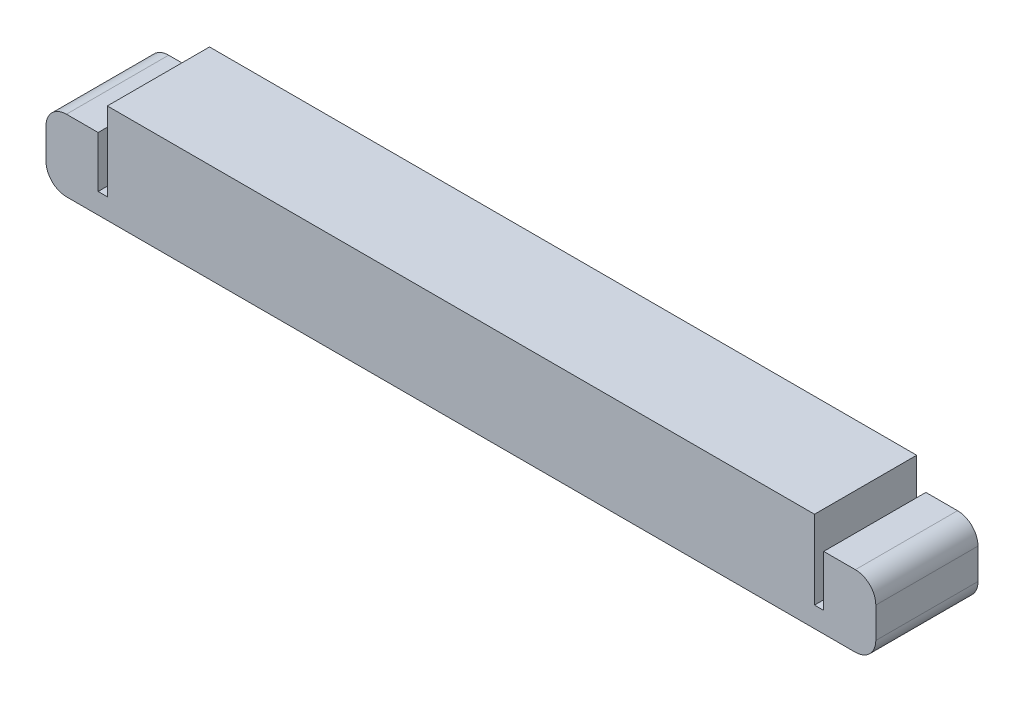
ISO-10303-21;
HEADER;
FILE_DESCRIPTION(('STEP AP214'),'2;1');
FILE_NAME('part.step','',(''),(''),'','','');
FILE_SCHEMA(('AUTOMOTIVE_DESIGN { 1 0 10303 214 1 1 1 1 }'));
ENDSEC;
DATA;
#1=APPLICATION_CONTEXT('core data for automotive mechanical design processes');
#2=APPLICATION_PROTOCOL_DEFINITION('international standard','automotive_design',2000,#1);
#3=PRODUCT_CONTEXT('',#1,'mechanical');
#4=PRODUCT('Part','Part','',(#3));
#5=PRODUCT_RELATED_PRODUCT_CATEGORY('part','',(#4));
#6=PRODUCT_DEFINITION_FORMATION('','',#4);
#7=PRODUCT_DEFINITION_CONTEXT('part definition',#1,'design');
#8=PRODUCT_DEFINITION('design','',#6,#7);
#9=PRODUCT_DEFINITION_SHAPE('','',#8);
#10=(LENGTH_UNIT() NAMED_UNIT(*) SI_UNIT(.MILLI.,.METRE.));
#11=(NAMED_UNIT(*) PLANE_ANGLE_UNIT() SI_UNIT($,.RADIAN.));
#12=(NAMED_UNIT(*) SI_UNIT($,.STERADIAN.) SOLID_ANGLE_UNIT());
#13=UNCERTAINTY_MEASURE_WITH_UNIT(LENGTH_MEASURE(1.E-05),#10,'distance_accuracy_value','');
#14=(GEOMETRIC_REPRESENTATION_CONTEXT(3) GLOBAL_UNCERTAINTY_ASSIGNED_CONTEXT((#13)) GLOBAL_UNIT_ASSIGNED_CONTEXT((#10,
#11,#12)) REPRESENTATION_CONTEXT('',''));
#15=CARTESIAN_POINT('',(0.,0.,0.));
#16=DIRECTION('',(0.,0.,1.));
#17=DIRECTION('',(1.,0.,0.));
#18=AXIS2_PLACEMENT_3D('',#15,#16,#17);
#19=CARTESIAN_POINT('',(0.,0.,0.));
#20=DIRECTION('',(0.,1.,0.));
#21=DIRECTION('',(0.,0.,1.));
#22=AXIS2_PLACEMENT_3D('',#19,#20,#21);
#23=PLANE('',#22);
#24=DIRECTION('',(1.,0.,0.));
#25=VECTOR('',#24,1.);
#26=CARTESIAN_POINT('',(86.5000000000001,0.,-62.5));
#27=LINE('',#26,#25);
#28=CARTESIAN_POINT('',(86.5000000000001,0.,-62.5));
#29=VERTEX_POINT('',#28);
#30=CARTESIAN_POINT('',(88.7500000000002,0.,-62.5));
#31=VERTEX_POINT('',#30);
#32=EDGE_CURVE('E215',#29,#31,#27,.T.);
#33=ORIENTED_EDGE('',*,*,#32,.T.);
#34=DIRECTION('',(0.,0.,1.));
#35=VECTOR('',#34,1.);
#36=CARTESIAN_POINT('',(88.7500000000002,0.,-87.5));
#37=LINE('',#36,#35);
#38=CARTESIAN_POINT('',(88.7500000000002,0.,-87.5));
#39=VERTEX_POINT('',#38);
#40=EDGE_CURVE('E166',#39,#31,#37,.T.);
#41=ORIENTED_EDGE('',*,*,#40,.F.);
#42=DIRECTION('',(-1.,0.,0.));
#43=VECTOR('',#42,1.);
#44=CARTESIAN_POINT('',(86.5000000000001,0.,-87.5));
#45=LINE('',#44,#43);
#46=CARTESIAN_POINT('',(86.5,0.,-87.5));
#47=VERTEX_POINT('',#46);
#48=EDGE_CURVE('E174',#39,#47,#45,.T.);
#49=ORIENTED_EDGE('',*,*,#48,.T.);
#50=DIRECTION('',(0.,0.,1.));
#51=VECTOR('',#50,1.);
#52=CARTESIAN_POINT('',(86.5000000000001,0.,-87.5));
#53=LINE('',#52,#51);
#54=EDGE_CURVE('E219',#47,#29,#53,.T.);
#55=ORIENTED_EDGE('',*,*,#54,.T.);
#56=EDGE_LOOP('',(#33,#41,#49,#55));
#57=FACE_BOUND('',#56,.T.);
#58=ADVANCED_FACE('F39',(#57),#23,.T.);
#59=CARTESIAN_POINT('',(0.,0.,0.));
#60=DIRECTION('',(0.,1.,0.));
#61=DIRECTION('',(0.,0.,1.));
#62=AXIS2_PLACEMENT_3D('',#59,#60,#61);
#63=PLANE('',#62);
#64=DIRECTION('',(-1.,0.,0.));
#65=VECTOR('',#64,1.);
#66=CARTESIAN_POINT('',(-86.4999999999999,0.,-87.5));
#67=LINE('',#66,#65);
#68=CARTESIAN_POINT('',(-86.4999999999999,0.,-87.5));
#69=VERTEX_POINT('',#68);
#70=CARTESIAN_POINT('',(-88.75,0.,-87.5));
#71=VERTEX_POINT('',#70);
#72=EDGE_CURVE('E231',#69,#71,#67,.T.);
#73=ORIENTED_EDGE('',*,*,#72,.T.);
#74=DIRECTION('',(0.,0.,-1.));
#75=VECTOR('',#74,1.);
#76=CARTESIAN_POINT('',(-88.75,0.,-87.5));
#77=LINE('',#76,#75);
#78=CARTESIAN_POINT('',(-88.75,0.,-62.5));
#79=VERTEX_POINT('',#78);
#80=EDGE_CURVE('E178',#79,#71,#77,.T.);
#81=ORIENTED_EDGE('',*,*,#80,.F.);
#82=DIRECTION('',(1.,0.,0.));
#83=VECTOR('',#82,1.);
#84=CARTESIAN_POINT('',(-86.4999999999999,0.,-62.5));
#85=LINE('',#84,#83);
#86=CARTESIAN_POINT('',(-86.5,0.,-62.5));
#87=VERTEX_POINT('',#86);
#88=EDGE_CURVE('E239',#79,#87,#85,.T.);
#89=ORIENTED_EDGE('',*,*,#88,.T.);
#90=DIRECTION('',(0.,0.,-1.));
#91=VECTOR('',#90,1.);
#92=CARTESIAN_POINT('',(-86.4999999999999,0.,-87.5));
#93=LINE('',#92,#91);
#94=EDGE_CURVE('E235',#87,#69,#93,.T.);
#95=ORIENTED_EDGE('',*,*,#94,.T.);
#96=EDGE_LOOP('',(#73,#81,#89,#95));
#97=FACE_BOUND('',#96,.T.);
#98=ADVANCED_FACE('F364',(#97),#63,.T.);
#99=CARTESIAN_POINT('',(86.5,19.25,-62.5));
#100=DIRECTION('',(-1.,0.,0.));
#101=DIRECTION('',(0.,0.,1.));
#102=AXIS2_PLACEMENT_3D('',#99,#100,#101);
#103=PLANE('',#102);
#104=ORIENTED_EDGE('',*,*,#54,.F.);
#105=DIRECTION('',(0.,-1.,0.));
#106=VECTOR('',#105,1.);
#107=CARTESIAN_POINT('',(86.5,19.25,-87.5));
#108=LINE('',#107,#106);
#109=CARTESIAN_POINT('',(86.5,19.25,-87.5));
#110=VERTEX_POINT('',#109);
#111=EDGE_CURVE('E279',#110,#47,#108,.T.);
#112=ORIENTED_EDGE('',*,*,#111,.F.);
#113=DIRECTION('',(0.,0.,-1.));
#114=VECTOR('',#113,1.);
#115=CARTESIAN_POINT('',(86.5,19.25,-62.5));
#116=LINE('',#115,#114);
#117=CARTESIAN_POINT('',(86.5,19.25,-62.5));
#118=VERTEX_POINT('',#117);
#119=EDGE_CURVE('E256',#118,#110,#116,.T.);
#120=ORIENTED_EDGE('',*,*,#119,.F.);
#121=DIRECTION('',(0.,-1.,0.));
#122=VECTOR('',#121,1.);
#123=CARTESIAN_POINT('',(86.5,19.25,-62.5));
#124=LINE('',#123,#122);
#125=EDGE_CURVE('E269',#118,#29,#124,.T.);
#126=ORIENTED_EDGE('',*,*,#125,.T.);
#127=EDGE_LOOP('',(#104,#112,#120,#126));
#128=FACE_BOUND('',#127,.T.);
#129=ADVANCED_FACE('F370',(#128),#103,.F.);
#130=CARTESIAN_POINT('',(-86.5,19.25,-62.5));
#131=DIRECTION('',(1.,0.,0.));
#132=DIRECTION('',(0.,0.,-1.));
#133=AXIS2_PLACEMENT_3D('',#130,#131,#132);
#134=PLANE('',#133);
#135=ORIENTED_EDGE('',*,*,#94,.F.);
#136=DIRECTION('',(0.,-1.,0.));
#137=VECTOR('',#136,1.);
#138=CARTESIAN_POINT('',(-86.5,19.25,-62.5));
#139=LINE('',#138,#137);
#140=CARTESIAN_POINT('',(-86.5,19.25,-62.5));
#141=VERTEX_POINT('',#140);
#142=EDGE_CURVE('E272',#141,#87,#139,.T.);
#143=ORIENTED_EDGE('',*,*,#142,.F.);
#144=DIRECTION('',(0.,0.,1.));
#145=VECTOR('',#144,1.);
#146=CARTESIAN_POINT('',(-86.5,19.25,-62.5));
#147=LINE('',#146,#145);
#148=CARTESIAN_POINT('',(-86.5,19.25,-87.5));
#149=VERTEX_POINT('',#148);
#150=EDGE_CURVE('E263',#149,#141,#147,.T.);
#151=ORIENTED_EDGE('',*,*,#150,.F.);
#152=DIRECTION('',(0.,-1.,0.));
#153=VECTOR('',#152,1.);
#154=CARTESIAN_POINT('',(-86.5,19.25,-87.5));
#155=LINE('',#154,#153);
#156=EDGE_CURVE('E276',#149,#69,#155,.T.);
#157=ORIENTED_EDGE('',*,*,#156,.T.);
#158=EDGE_LOOP('',(#135,#143,#151,#157));
#159=FACE_BOUND('',#158,.T.);
#160=ADVANCED_FACE('F386',(#159),#134,.F.);
#161=CARTESIAN_POINT('',(-86.5,19.25,-87.5));
#162=DIRECTION('',(0.,0.,1.));
#163=DIRECTION('',(1.,0.,0.));
#164=AXIS2_PLACEMENT_3D('',#161,#162,#163);
#165=PLANE('',#164);
#166=DIRECTION('',(0.,-1.,0.));
#167=VECTOR('',#166,1.);
#168=CARTESIAN_POINT('',(101.5,29.1547594742265,-87.5000000000001));
#169=LINE('',#168,#167);
#170=CARTESIAN_POINT('',(101.5,7.5,-87.5000000000001));
#171=VERTEX_POINT('',#170);
#172=CARTESIAN_POINT('',(101.5,0.,-87.5000000000001));
#173=VERTEX_POINT('',#172);
#174=EDGE_CURVE('E225',#171,#173,#169,.T.);
#175=ORIENTED_EDGE('',*,*,#174,.T.);
#176=CARTESIAN_POINT('',(96.5000000000001,0.,-87.5));
#177=DIRECTION('',(0.,0.,1.));
#178=DIRECTION('',(1.,0.,0.));
#179=AXIS2_PLACEMENT_3D('',#176,#177,#178);
#180=CIRCLE('',#179,5.);
#181=CARTESIAN_POINT('',(96.5000000000001,-5.,-87.5));
#182=VERTEX_POINT('',#181);
#183=EDGE_CURVE('E298',#173,#182,#180,.F.);
#184=ORIENTED_EDGE('',*,*,#183,.T.);
#185=DIRECTION('',(-1.,0.,0.));
#186=VECTOR('',#185,1.);
#187=CARTESIAN_POINT('',(-86.5,-5.,-87.5));
#188=LINE('',#187,#186);
#189=CARTESIAN_POINT('',(-96.4999999999999,-5.,-87.5));
#190=VERTEX_POINT('',#189);
#191=EDGE_CURVE('E234',#182,#190,#188,.T.);
#192=ORIENTED_EDGE('',*,*,#191,.T.);
#193=CARTESIAN_POINT('',(-96.4999999999999,0.,-87.5));
#194=DIRECTION('',(0.,0.,1.));
#195=DIRECTION('',(1.,0.,0.));
#196=AXIS2_PLACEMENT_3D('',#193,#194,#195);
#197=CIRCLE('',#196,5.);
#198=CARTESIAN_POINT('',(-101.5,0.,-87.5));
#199=VERTEX_POINT('',#198);
#200=EDGE_CURVE('E292',#190,#199,#197,.F.);
#201=ORIENTED_EDGE('',*,*,#200,.T.);
#202=DIRECTION('',(0.,-1.,0.));
#203=VECTOR('',#202,1.);
#204=CARTESIAN_POINT('',(-101.5,29.1547594742265,-87.5));
#205=LINE('',#204,#203);
#206=CARTESIAN_POINT('',(-101.5,7.5,-87.5));
#207=VERTEX_POINT('',#206);
#208=EDGE_CURVE('E218',#207,#199,#205,.T.);
#209=ORIENTED_EDGE('',*,*,#208,.F.);
#210=CARTESIAN_POINT('',(-96.4999999999999,7.5,-87.5));
#211=DIRECTION('',(0.,0.,1.));
#212=DIRECTION('',(1.,0.,0.));
#213=AXIS2_PLACEMENT_3D('',#210,#211,#212);
#214=CIRCLE('',#213,5.);
#215=CARTESIAN_POINT('',(-96.4999999999999,12.5,-87.5));
#216=VERTEX_POINT('',#215);
#217=EDGE_CURVE('E289',#207,#216,#214,.F.);
#218=ORIENTED_EDGE('',*,*,#217,.T.);
#219=DIRECTION('',(-1.,0.,0.));
#220=VECTOR('',#219,1.);
#221=CARTESIAN_POINT('',(-101.5,12.5,-87.5));
#222=LINE('',#221,#220);
#223=CARTESIAN_POINT('',(-88.75,12.5,-87.5));
#224=VERTEX_POINT('',#223);
#225=EDGE_CURVE('E199',#224,#216,#222,.T.);
#226=ORIENTED_EDGE('',*,*,#225,.F.);
#227=DIRECTION('',(0.,-1.,0.));
#228=VECTOR('',#227,1.);
#229=CARTESIAN_POINT('',(-88.75,12.5,-87.5));
#230=LINE('',#229,#228);
#231=EDGE_CURVE('E203',#224,#71,#230,.T.);
#232=ORIENTED_EDGE('',*,*,#231,.T.);
#233=ORIENTED_EDGE('',*,*,#72,.F.);
#234=ORIENTED_EDGE('',*,*,#156,.F.);
#235=DIRECTION('',(-1.,0.,0.));
#236=VECTOR('',#235,1.);
#237=CARTESIAN_POINT('',(-86.5,19.25,-87.5));
#238=LINE('',#237,#236);
#239=EDGE_CURVE('E260',#110,#149,#238,.T.);
#240=ORIENTED_EDGE('',*,*,#239,.F.);
#241=ORIENTED_EDGE('',*,*,#111,.T.);
#242=ORIENTED_EDGE('',*,*,#48,.F.);
#243=DIRECTION('',(0.,-1.,0.));
#244=VECTOR('',#243,1.);
#245=CARTESIAN_POINT('',(88.7500000000002,12.5,-87.5));
#246=LINE('',#245,#244);
#247=CARTESIAN_POINT('',(88.7500000000002,12.5,-87.5));
#248=VERTEX_POINT('',#247);
#249=EDGE_CURVE('E170',#248,#39,#246,.T.);
#250=ORIENTED_EDGE('',*,*,#249,.F.);
#251=DIRECTION('',(-1.,0.,0.));
#252=VECTOR('',#251,1.);
#253=CARTESIAN_POINT('',(101.5,12.5,-87.5000000000001));
#254=LINE('',#253,#252);
#255=CARTESIAN_POINT('',(96.5000000000001,12.5,-87.5));
#256=VERTEX_POINT('',#255);
#257=EDGE_CURVE('E156',#256,#248,#254,.T.);
#258=ORIENTED_EDGE('',*,*,#257,.F.);
#259=CARTESIAN_POINT('',(96.5000000000001,7.5,-87.5));
#260=DIRECTION('',(0.,0.,1.));
#261=DIRECTION('',(1.,0.,0.));
#262=AXIS2_PLACEMENT_3D('',#259,#260,#261);
#263=CIRCLE('',#262,5.);
#264=EDGE_CURVE('E295',#256,#171,#263,.F.);
#265=ORIENTED_EDGE('',*,*,#264,.T.);
#266=EDGE_LOOP('',(#175,#184,#192,#201,#209,#218,#226,#232,#233,#234,#240,#241,#242,#250,#258,#265));
#267=FACE_BOUND('',#266,.T.);
#268=ADVANCED_FACE('F172',(#267),#165,.F.);
#269=CARTESIAN_POINT('',(-86.5,19.25,-62.5));
#270=DIRECTION('',(0.,0.,-1.));
#271=DIRECTION('',(-1.,0.,0.));
#272=AXIS2_PLACEMENT_3D('',#269,#270,#271);
#273=PLANE('',#272);
#274=DIRECTION('',(1.,0.,0.));
#275=VECTOR('',#274,1.);
#276=CARTESIAN_POINT('',(-86.5,-5.,-62.5));
#277=LINE('',#276,#275);
#278=CARTESIAN_POINT('',(-96.4999999999999,-5.,-62.5));
#279=VERTEX_POINT('',#278);
#280=CARTESIAN_POINT('',(96.5000000000001,-5.,-62.5));
#281=VERTEX_POINT('',#280);
#282=EDGE_CURVE('E252',#279,#281,#277,.T.);
#283=ORIENTED_EDGE('',*,*,#282,.T.);
#284=CARTESIAN_POINT('',(96.5000000000001,0.,-62.5));
#285=DIRECTION('',(0.,0.,-1.));
#286=DIRECTION('',(-1.,0.,0.));
#287=AXIS2_PLACEMENT_3D('',#284,#285,#286);
#288=CIRCLE('',#287,5.);
#289=CARTESIAN_POINT('',(101.5,0.,-62.5));
#290=VERTEX_POINT('',#289);
#291=EDGE_CURVE('E314',#281,#290,#288,.F.);
#292=ORIENTED_EDGE('',*,*,#291,.T.);
#293=DIRECTION('',(0.,-1.,0.));
#294=VECTOR('',#293,1.);
#295=CARTESIAN_POINT('',(101.5,29.1547594742265,-62.5));
#296=LINE('',#295,#294);
#297=CARTESIAN_POINT('',(101.5,7.5,-62.5));
#298=VERTEX_POINT('',#297);
#299=EDGE_CURVE('E214',#298,#290,#296,.T.);
#300=ORIENTED_EDGE('',*,*,#299,.F.);
#301=CARTESIAN_POINT('',(96.5000000000001,7.5,-62.5));
#302=DIRECTION('',(0.,0.,-1.));
#303=DIRECTION('',(-1.,0.,0.));
#304=AXIS2_PLACEMENT_3D('',#301,#302,#303);
#305=CIRCLE('',#304,5.);
#306=CARTESIAN_POINT('',(96.5000000000001,12.5,-62.5));
#307=VERTEX_POINT('',#306);
#308=EDGE_CURVE('E55',#298,#307,#305,.F.);
#309=ORIENTED_EDGE('',*,*,#308,.T.);
#310=DIRECTION('',(1.,0.,0.));
#311=VECTOR('',#310,1.);
#312=CARTESIAN_POINT('',(101.5,12.5,-62.5));
#313=LINE('',#312,#311);
#314=CARTESIAN_POINT('',(88.7500000000002,12.5,-62.5));
#315=VERTEX_POINT('',#314);
#316=EDGE_CURVE('E184',#315,#307,#313,.T.);
#317=ORIENTED_EDGE('',*,*,#316,.F.);
#318=DIRECTION('',(0.,-1.,0.));
#319=VECTOR('',#318,1.);
#320=CARTESIAN_POINT('',(88.7500000000002,12.5,-62.5));
#321=LINE('',#320,#319);
#322=EDGE_CURVE('E179',#315,#31,#321,.T.);
#323=ORIENTED_EDGE('',*,*,#322,.T.);
#324=ORIENTED_EDGE('',*,*,#32,.F.);
#325=ORIENTED_EDGE('',*,*,#125,.F.);
#326=DIRECTION('',(1.,0.,0.));
#327=VECTOR('',#326,1.);
#328=CARTESIAN_POINT('',(-86.5,19.25,-62.5));
#329=LINE('',#328,#327);
#330=EDGE_CURVE('E266',#141,#118,#329,.T.);
#331=ORIENTED_EDGE('',*,*,#330,.F.);
#332=ORIENTED_EDGE('',*,*,#142,.T.);
#333=ORIENTED_EDGE('',*,*,#88,.F.);
#334=DIRECTION('',(0.,-1.,0.));
#335=VECTOR('',#334,1.);
#336=CARTESIAN_POINT('',(-88.75,12.5,-62.5));
#337=LINE('',#336,#335);
#338=CARTESIAN_POINT('',(-88.75,12.5,-62.5));
#339=VERTEX_POINT('',#338);
#340=EDGE_CURVE('E210',#339,#79,#337,.T.);
#341=ORIENTED_EDGE('',*,*,#340,.F.);
#342=DIRECTION('',(1.,0.,0.));
#343=VECTOR('',#342,1.);
#344=CARTESIAN_POINT('',(-101.5,12.5,-62.5));
#345=LINE('',#344,#343);
#346=CARTESIAN_POINT('',(-96.4999999999999,12.5,-62.5));
#347=VERTEX_POINT('',#346);
#348=EDGE_CURVE('E193',#347,#339,#345,.T.);
#349=ORIENTED_EDGE('',*,*,#348,.F.);
#350=CARTESIAN_POINT('',(-96.4999999999999,7.5,-62.5));
#351=DIRECTION('',(0.,0.,-1.));
#352=DIRECTION('',(-1.,0.,0.));
#353=AXIS2_PLACEMENT_3D('',#350,#351,#352);
#354=CIRCLE('',#353,5.);
#355=CARTESIAN_POINT('',(-101.5,7.5,-62.5));
#356=VERTEX_POINT('',#355);
#357=EDGE_CURVE('E307',#347,#356,#354,.F.);
#358=ORIENTED_EDGE('',*,*,#357,.T.);
#359=DIRECTION('',(0.,-1.,0.));
#360=VECTOR('',#359,1.);
#361=CARTESIAN_POINT('',(-101.5,29.1547594742265,-62.5));
#362=LINE('',#361,#360);
#363=CARTESIAN_POINT('',(-101.5,0.,-62.5));
#364=VERTEX_POINT('',#363);
#365=EDGE_CURVE('E242',#356,#364,#362,.T.);
#366=ORIENTED_EDGE('',*,*,#365,.T.);
#367=CARTESIAN_POINT('',(-96.4999999999999,0.,-62.5));
#368=DIRECTION('',(0.,0.,-1.));
#369=DIRECTION('',(-1.,0.,0.));
#370=AXIS2_PLACEMENT_3D('',#367,#368,#369);
#371=CIRCLE('',#370,5.);
#372=EDGE_CURVE('E63',#364,#279,#371,.F.);
#373=ORIENTED_EDGE('',*,*,#372,.T.);
#374=EDGE_LOOP('',(#283,#292,#300,#309,#317,#323,#324,#325,#331,#332,#333,#341,#349,#358,#366,#373));
#375=FACE_BOUND('',#374,.T.);
#376=ADVANCED_FACE('F328',(#375),#273,.F.);
#377=CARTESIAN_POINT('',(0.,19.25,0.));
#378=DIRECTION('',(0.,-1.,0.));
#379=DIRECTION('',(0.,0.,-1.));
#380=AXIS2_PLACEMENT_3D('',#377,#378,#379);
#381=PLANE('',#380);
#382=ORIENTED_EDGE('',*,*,#119,.T.);
#383=ORIENTED_EDGE('',*,*,#239,.T.);
#384=ORIENTED_EDGE('',*,*,#150,.T.);
#385=ORIENTED_EDGE('',*,*,#330,.T.);
#386=EDGE_LOOP('',(#382,#383,#384,#385));
#387=FACE_BOUND('',#386,.T.);
#388=ADVANCED_FACE('F380',(#387),#381,.F.);
#389=CARTESIAN_POINT('',(0.,-5.,0.));
#390=DIRECTION('',(0.,-1.,0.));
#391=DIRECTION('',(0.,0.,-1.));
#392=AXIS2_PLACEMENT_3D('',#389,#390,#391);
#393=PLANE('',#392);
#394=ORIENTED_EDGE('',*,*,#191,.F.);
#395=DIRECTION('',(0.,0.,-1.));
#396=VECTOR('',#395,1.);
#397=CARTESIAN_POINT('',(96.5000000000001,-5.,-62.5));
#398=LINE('',#397,#396);
#399=EDGE_CURVE('E304',#182,#281,#398,.F.);
#400=ORIENTED_EDGE('',*,*,#399,.T.);
#401=ORIENTED_EDGE('',*,*,#282,.F.);
#402=DIRECTION('',(0.,0.,1.));
#403=VECTOR('',#402,1.);
#404=CARTESIAN_POINT('',(-96.4999999999999,-5.,-87.5));
#405=LINE('',#404,#403);
#406=EDGE_CURVE('E301',#279,#190,#405,.F.);
#407=ORIENTED_EDGE('',*,*,#406,.T.);
#408=EDGE_LOOP('',(#394,#400,#401,#407));
#409=FACE_BOUND('',#408,.T.);
#410=ADVANCED_FACE('F344',(#409),#393,.T.);
#411=CARTESIAN_POINT('',(-101.5,29.1547594742265,-87.5));
#412=DIRECTION('',(1.,0.,0.));
#413=DIRECTION('',(0.,0.,-1.));
#414=AXIS2_PLACEMENT_3D('',#411,#412,#413);
#415=PLANE('',#414);
#416=ORIENTED_EDGE('',*,*,#208,.T.);
#417=DIRECTION('',(0.,0.,1.));
#418=VECTOR('',#417,1.);
#419=CARTESIAN_POINT('',(-101.5,0.,-62.5));
#420=LINE('',#419,#418);
#421=EDGE_CURVE('E48',#199,#364,#420,.T.);
#422=ORIENTED_EDGE('',*,*,#421,.T.);
#423=ORIENTED_EDGE('',*,*,#365,.F.);
#424=DIRECTION('',(0.,0.,1.));
#425=VECTOR('',#424,1.);
#426=CARTESIAN_POINT('',(-101.5,7.5,-87.5));
#427=LINE('',#426,#425);
#428=EDGE_CURVE('E319',#356,#207,#427,.F.);
#429=ORIENTED_EDGE('',*,*,#428,.T.);
#430=EDGE_LOOP('',(#416,#422,#423,#429));
#431=FACE_BOUND('',#430,.T.);
#432=ADVANCED_FACE('F324',(#431),#415,.F.);
#433=CARTESIAN_POINT('',(101.5,29.1547594742265,-87.5000000000001));
#434=DIRECTION('',(-1.,0.,0.));
#435=DIRECTION('',(0.,0.,1.));
#436=AXIS2_PLACEMENT_3D('',#433,#434,#435);
#437=PLANE('',#436);
#438=ORIENTED_EDGE('',*,*,#299,.T.);
#439=DIRECTION('',(0.,0.,-1.));
#440=VECTOR('',#439,1.);
#441=CARTESIAN_POINT('',(101.5,0.,-87.5000000000001));
#442=LINE('',#441,#440);
#443=EDGE_CURVE('E285',#290,#173,#442,.T.);
#444=ORIENTED_EDGE('',*,*,#443,.T.);
#445=ORIENTED_EDGE('',*,*,#174,.F.);
#446=DIRECTION('',(0.,0.,-1.));
#447=VECTOR('',#446,1.);
#448=CARTESIAN_POINT('',(101.5,7.5,-87.5000000000001));
#449=LINE('',#448,#447);
#450=EDGE_CURVE('E282',#171,#298,#449,.F.);
#451=ORIENTED_EDGE('',*,*,#450,.T.);
#452=EDGE_LOOP('',(#438,#444,#445,#451));
#453=FACE_BOUND('',#452,.T.);
#454=ADVANCED_FACE('F352',(#453),#437,.F.);
#455=CARTESIAN_POINT('',(-88.75,12.5,-87.5));
#456=DIRECTION('',(-1.,0.,0.));
#457=DIRECTION('',(0.,0.,1.));
#458=AXIS2_PLACEMENT_3D('',#455,#456,#457);
#459=PLANE('',#458);
#460=ORIENTED_EDGE('',*,*,#80,.T.);
#461=ORIENTED_EDGE('',*,*,#231,.F.);
#462=DIRECTION('',(0.,0.,-1.));
#463=VECTOR('',#462,1.);
#464=CARTESIAN_POINT('',(-88.75,12.5,-87.5));
#465=LINE('',#464,#463);
#466=EDGE_CURVE('E196',#339,#224,#465,.T.);
#467=ORIENTED_EDGE('',*,*,#466,.F.);
#468=ORIENTED_EDGE('',*,*,#340,.T.);
#469=EDGE_LOOP('',(#460,#461,#467,#468));
#470=FACE_BOUND('',#469,.T.);
#471=ADVANCED_FACE('F408',(#470),#459,.F.);
#472=CARTESIAN_POINT('',(0.,12.5,0.));
#473=DIRECTION('',(0.,1.,0.));
#474=DIRECTION('',(0.,0.,1.));
#475=AXIS2_PLACEMENT_3D('',#472,#473,#474);
#476=PLANE('',#475);
#477=ORIENTED_EDGE('',*,*,#225,.T.);
#478=DIRECTION('',(0.,0.,1.));
#479=VECTOR('',#478,1.);
#480=CARTESIAN_POINT('',(-96.4999999999999,12.5,-62.5));
#481=LINE('',#480,#479);
#482=EDGE_CURVE('E11',#216,#347,#481,.T.);
#483=ORIENTED_EDGE('',*,*,#482,.T.);
#484=ORIENTED_EDGE('',*,*,#348,.T.);
#485=ORIENTED_EDGE('',*,*,#466,.T.);
#486=EDGE_LOOP('',(#477,#483,#484,#485));
#487=FACE_BOUND('',#486,.T.);
#488=ADVANCED_FACE('F336',(#487),#476,.T.);
#489=CARTESIAN_POINT('',(88.7500000000002,12.5,-87.5));
#490=DIRECTION('',(1.,0.,0.));
#491=DIRECTION('',(0.,0.,-1.));
#492=AXIS2_PLACEMENT_3D('',#489,#490,#491);
#493=PLANE('',#492);
#494=ORIENTED_EDGE('',*,*,#40,.T.);
#495=ORIENTED_EDGE('',*,*,#322,.F.);
#496=DIRECTION('',(0.,0.,1.));
#497=VECTOR('',#496,1.);
#498=CARTESIAN_POINT('',(88.7500000000002,12.5,-87.5));
#499=LINE('',#498,#497);
#500=EDGE_CURVE('E160',#248,#315,#499,.T.);
#501=ORIENTED_EDGE('',*,*,#500,.F.);
#502=ORIENTED_EDGE('',*,*,#249,.T.);
#503=EDGE_LOOP('',(#494,#495,#501,#502));
#504=FACE_BOUND('',#503,.T.);
#505=ADVANCED_FACE('F181',(#504),#493,.F.);
#506=CARTESIAN_POINT('',(0.,12.5,0.));
#507=DIRECTION('',(0.,-1.,0.));
#508=DIRECTION('',(0.,0.,-1.));
#509=AXIS2_PLACEMENT_3D('',#506,#507,#508);
#510=PLANE('',#509);
#511=ORIENTED_EDGE('',*,*,#316,.T.);
#512=DIRECTION('',(0.,0.,-1.));
#513=VECTOR('',#512,1.);
#514=CARTESIAN_POINT('',(96.5000000000001,12.5,0.));
#515=LINE('',#514,#513);
#516=EDGE_CURVE('E163',#307,#256,#515,.T.);
#517=ORIENTED_EDGE('',*,*,#516,.T.);
#518=ORIENTED_EDGE('',*,*,#257,.T.);
#519=ORIENTED_EDGE('',*,*,#500,.T.);
#520=EDGE_LOOP('',(#511,#517,#518,#519));
#521=FACE_BOUND('',#520,.T.);
#522=ADVANCED_FACE('F158',(#521),#510,.F.);
#523=CARTESIAN_POINT('',(96.5000000000001,0.,-87.5000000000001));
#524=DIRECTION('',(0.,0.,1.));
#525=DIRECTION('',(1.,0.,0.));
#526=AXIS2_PLACEMENT_3D('',#523,#524,#525);
#527=CYLINDRICAL_SURFACE('',#526,5.);
#528=ORIENTED_EDGE('',*,*,#291,.F.);
#529=ORIENTED_EDGE('',*,*,#399,.F.);
#530=ORIENTED_EDGE('',*,*,#183,.F.);
#531=ORIENTED_EDGE('',*,*,#443,.F.);
#532=EDGE_LOOP('',(#528,#529,#530,#531));
#533=FACE_BOUND('',#532,.T.);
#534=ADVANCED_FACE('F349',(#533),#527,.T.);
#535=CARTESIAN_POINT('',(96.5000000000001,7.5,0.));
#536=DIRECTION('',(0.,0.,-1.));
#537=DIRECTION('',(-1.,0.,0.));
#538=AXIS2_PLACEMENT_3D('',#535,#536,#537);
#539=CYLINDRICAL_SURFACE('',#538,5.);
#540=ORIENTED_EDGE('',*,*,#308,.F.);
#541=ORIENTED_EDGE('',*,*,#450,.F.);
#542=ORIENTED_EDGE('',*,*,#264,.F.);
#543=ORIENTED_EDGE('',*,*,#516,.F.);
#544=EDGE_LOOP('',(#540,#541,#542,#543));
#545=FACE_BOUND('',#544,.T.);
#546=ADVANCED_FACE('F355',(#545),#539,.T.);
#547=CARTESIAN_POINT('',(-96.4999999999999,0.,-87.5));
#548=DIRECTION('',(0.,0.,-1.));
#549=DIRECTION('',(-1.,0.,0.));
#550=AXIS2_PLACEMENT_3D('',#547,#548,#549);
#551=CYLINDRICAL_SURFACE('',#550,5.);
#552=ORIENTED_EDGE('',*,*,#200,.F.);
#553=ORIENTED_EDGE('',*,*,#406,.F.);
#554=ORIENTED_EDGE('',*,*,#372,.F.);
#555=ORIENTED_EDGE('',*,*,#421,.F.);
#556=EDGE_LOOP('',(#552,#553,#554,#555));
#557=FACE_BOUND('',#556,.T.);
#558=ADVANCED_FACE('F342',(#557),#551,.T.);
#559=CARTESIAN_POINT('',(-96.4999999999999,7.5,0.));
#560=DIRECTION('',(0.,0.,-1.));
#561=DIRECTION('',(-1.,0.,0.));
#562=AXIS2_PLACEMENT_3D('',#559,#560,#561);
#563=CYLINDRICAL_SURFACE('',#562,5.);
#564=ORIENTED_EDGE('',*,*,#217,.F.);
#565=ORIENTED_EDGE('',*,*,#428,.F.);
#566=ORIENTED_EDGE('',*,*,#357,.F.);
#567=ORIENTED_EDGE('',*,*,#482,.F.);
#568=EDGE_LOOP('',(#564,#565,#566,#567));
#569=FACE_BOUND('',#568,.T.);
#570=ADVANCED_FACE('F41',(#569),#563,.T.);
#571=CLOSED_SHELL('',(#58,#98,#129,#160,#268,#376,#388,#410,#432,#454,#471,#488,#505,#522,#534,
#546,#558,#570));
#572=MANIFOLD_SOLID_BREP('B2',#571);
#573=ADVANCED_BREP_SHAPE_REPRESENTATION('',(#18,#572),#14);
#574=SHAPE_DEFINITION_REPRESENTATION(#9,#573);
ENDSEC;
END-ISO-10303-21;
